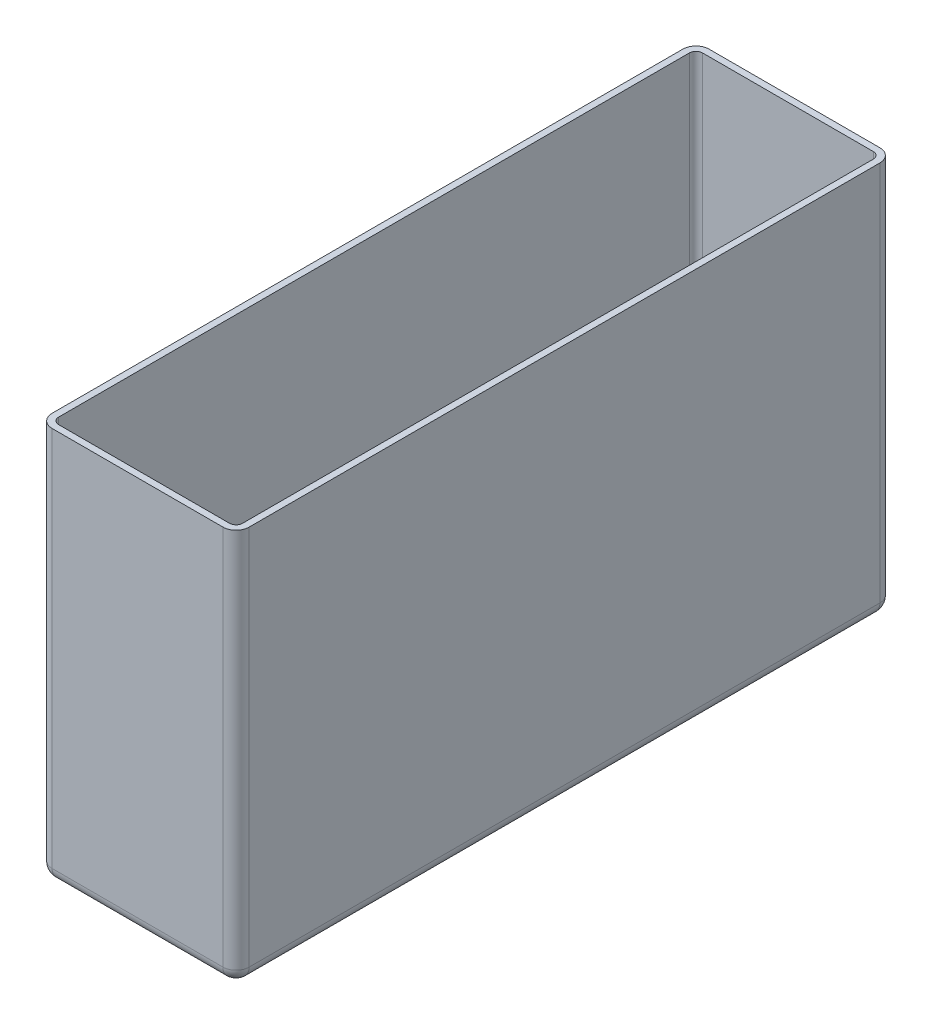
ISO-10303-21;
HEADER;
FILE_DESCRIPTION(('STEP AP214'),'2;1');
FILE_NAME('part.step','',(''),(''),'','','');
FILE_SCHEMA(('AUTOMOTIVE_DESIGN { 1 0 10303 214 1 1 1 1 }'));
ENDSEC;
DATA;
#1=APPLICATION_CONTEXT('core data for automotive mechanical design processes');
#2=APPLICATION_PROTOCOL_DEFINITION('international standard','automotive_design',2000,#1);
#3=PRODUCT_CONTEXT('',#1,'mechanical');
#4=PRODUCT('Part','Part','',(#3));
#5=PRODUCT_RELATED_PRODUCT_CATEGORY('part','',(#4));
#6=PRODUCT_DEFINITION_FORMATION('','',#4);
#7=PRODUCT_DEFINITION_CONTEXT('part definition',#1,'design');
#8=PRODUCT_DEFINITION('design','',#6,#7);
#9=PRODUCT_DEFINITION_SHAPE('','',#8);
#10=(LENGTH_UNIT() NAMED_UNIT(*) SI_UNIT(.MILLI.,.METRE.));
#11=(NAMED_UNIT(*) PLANE_ANGLE_UNIT() SI_UNIT($,.RADIAN.));
#12=(NAMED_UNIT(*) SI_UNIT($,.STERADIAN.) SOLID_ANGLE_UNIT());
#13=UNCERTAINTY_MEASURE_WITH_UNIT(LENGTH_MEASURE(1.E-05),#10,'distance_accuracy_value','');
#14=(GEOMETRIC_REPRESENTATION_CONTEXT(3) GLOBAL_UNCERTAINTY_ASSIGNED_CONTEXT((#13)) GLOBAL_UNIT_ASSIGNED_CONTEXT((#10,
#11,#12)) REPRESENTATION_CONTEXT('',''));
#15=CARTESIAN_POINT('',(0.,0.,0.));
#16=DIRECTION('',(0.,0.,1.));
#17=DIRECTION('',(1.,0.,0.));
#18=AXIS2_PLACEMENT_3D('',#15,#16,#17);
#19=CARTESIAN_POINT('',(-75.,300.,250.));
#20=DIRECTION('',(1.,0.,0.));
#21=DIRECTION('',(0.,0.,-1.));
#22=AXIS2_PLACEMENT_3D('',#19,#20,#21);
#23=PLANE('',#22);
#24=DIRECTION('',(0.,0.,1.));
#25=VECTOR('',#24,1.);
#26=CARTESIAN_POINT('',(-75.,300.,250.));
#27=LINE('',#26,#25);
#28=CARTESIAN_POINT('',(-75.,300.,-240.));
#29=VERTEX_POINT('',#28);
#30=CARTESIAN_POINT('',(-75.,300.,240.));
#31=VERTEX_POINT('',#30);
#32=EDGE_CURVE('E276',#29,#31,#27,.T.);
#33=ORIENTED_EDGE('',*,*,#32,.F.);
#34=DIRECTION('',(0.,-1.,0.));
#35=VECTOR('',#34,1.);
#36=CARTESIAN_POINT('',(-75.,300.,-240.));
#37=LINE('',#36,#35);
#38=CARTESIAN_POINT('',(-75.,10.,-240.));
#39=VERTEX_POINT('',#38);
#40=EDGE_CURVE('E56',#29,#39,#37,.T.);
#41=ORIENTED_EDGE('',*,*,#40,.T.);
#42=DIRECTION('',(0.,0.,1.));
#43=VECTOR('',#42,1.);
#44=CARTESIAN_POINT('',(-75.,10.,250.));
#45=LINE('',#44,#43);
#46=CARTESIAN_POINT('',(-75.,10.,240.));
#47=VERTEX_POINT('',#46);
#48=EDGE_CURVE('E318',#39,#47,#45,.T.);
#49=ORIENTED_EDGE('',*,*,#48,.T.);
#50=DIRECTION('',(0.,-1.,0.));
#51=VECTOR('',#50,1.);
#52=CARTESIAN_POINT('',(-75.,300.,240.));
#53=LINE('',#52,#51);
#54=EDGE_CURVE('E316',#47,#31,#53,.F.);
#55=ORIENTED_EDGE('',*,*,#54,.T.);
#56=EDGE_LOOP('',(#33,#41,#49,#55));
#57=FACE_BOUND('',#56,.T.);
#58=ADVANCED_FACE('F31',(#57),#23,.F.);
#59=CARTESIAN_POINT('',(75.,300.,250.));
#60=DIRECTION('',(0.,0.,-1.));
#61=DIRECTION('',(-1.,0.,0.));
#62=AXIS2_PLACEMENT_3D('',#59,#60,#61);
#63=PLANE('',#62);
#64=DIRECTION('',(1.,0.,0.));
#65=VECTOR('',#64,1.);
#66=CARTESIAN_POINT('',(75.,10.,250.));
#67=LINE('',#66,#65);
#68=CARTESIAN_POINT('',(-65.,10.,250.));
#69=VERTEX_POINT('',#68);
#70=CARTESIAN_POINT('',(65.,10.,250.));
#71=VERTEX_POINT('',#70);
#72=EDGE_CURVE('E290',#69,#71,#67,.T.);
#73=ORIENTED_EDGE('',*,*,#72,.T.);
#74=DIRECTION('',(0.,-1.,0.));
#75=VECTOR('',#74,1.);
#76=CARTESIAN_POINT('',(65.,300.,250.));
#77=LINE('',#76,#75);
#78=CARTESIAN_POINT('',(65.,300.,250.));
#79=VERTEX_POINT('',#78);
#80=EDGE_CURVE('E293',#71,#79,#77,.F.);
#81=ORIENTED_EDGE('',*,*,#80,.T.);
#82=DIRECTION('',(1.,0.,0.));
#83=VECTOR('',#82,1.);
#84=CARTESIAN_POINT('',(75.,300.,250.));
#85=LINE('',#84,#83);
#86=CARTESIAN_POINT('',(-65.,300.,250.));
#87=VERTEX_POINT('',#86);
#88=EDGE_CURVE('E279',#87,#79,#85,.T.);
#89=ORIENTED_EDGE('',*,*,#88,.F.);
#90=DIRECTION('',(0.,-1.,0.));
#91=VECTOR('',#90,1.);
#92=CARTESIAN_POINT('',(-65.,300.,250.));
#93=LINE('',#92,#91);
#94=EDGE_CURVE('E288',#87,#69,#93,.T.);
#95=ORIENTED_EDGE('',*,*,#94,.T.);
#96=EDGE_LOOP('',(#73,#81,#89,#95));
#97=FACE_BOUND('',#96,.T.);
#98=ADVANCED_FACE('F379',(#97),#63,.F.);
#99=CARTESIAN_POINT('',(75.,300.,250.));
#100=DIRECTION('',(-1.,0.,0.));
#101=DIRECTION('',(0.,0.,1.));
#102=AXIS2_PLACEMENT_3D('',#99,#100,#101);
#103=PLANE('',#102);
#104=DIRECTION('',(0.,0.,-1.));
#105=VECTOR('',#104,1.);
#106=CARTESIAN_POINT('',(75.,10.,250.));
#107=LINE('',#106,#105);
#108=CARTESIAN_POINT('',(75.,10.,240.));
#109=VERTEX_POINT('',#108);
#110=CARTESIAN_POINT('',(75.,10.,-240.));
#111=VERTEX_POINT('',#110);
#112=EDGE_CURVE('E306',#109,#111,#107,.T.);
#113=ORIENTED_EDGE('',*,*,#112,.T.);
#114=DIRECTION('',(0.,-1.,0.));
#115=VECTOR('',#114,1.);
#116=CARTESIAN_POINT('',(75.,300.,-240.));
#117=LINE('',#116,#115);
#118=CARTESIAN_POINT('',(75.,300.,-240.));
#119=VERTEX_POINT('',#118);
#120=EDGE_CURVE('E308',#111,#119,#117,.F.);
#121=ORIENTED_EDGE('',*,*,#120,.T.);
#122=DIRECTION('',(0.,0.,-1.));
#123=VECTOR('',#122,1.);
#124=CARTESIAN_POINT('',(75.,300.,250.));
#125=LINE('',#124,#123);
#126=CARTESIAN_POINT('',(75.,300.,240.));
#127=VERTEX_POINT('',#126);
#128=EDGE_CURVE('E282',#127,#119,#125,.T.);
#129=ORIENTED_EDGE('',*,*,#128,.F.);
#130=DIRECTION('',(0.,-1.,0.));
#131=VECTOR('',#130,1.);
#132=CARTESIAN_POINT('',(75.,300.,240.));
#133=LINE('',#132,#131);
#134=EDGE_CURVE('E304',#127,#109,#133,.T.);
#135=ORIENTED_EDGE('',*,*,#134,.T.);
#136=EDGE_LOOP('',(#113,#121,#129,#135));
#137=FACE_BOUND('',#136,.T.);
#138=ADVANCED_FACE('F389',(#137),#103,.F.);
#139=CARTESIAN_POINT('',(75.,300.,-250.));
#140=DIRECTION('',(0.,0.,1.));
#141=DIRECTION('',(1.,0.,0.));
#142=AXIS2_PLACEMENT_3D('',#139,#140,#141);
#143=PLANE('',#142);
#144=DIRECTION('',(-1.,0.,0.));
#145=VECTOR('',#144,1.);
#146=CARTESIAN_POINT('',(75.,10.,-250.));
#147=LINE('',#146,#145);
#148=CARTESIAN_POINT('',(65.,10.,-250.));
#149=VERTEX_POINT('',#148);
#150=CARTESIAN_POINT('',(-65.,10.,-250.));
#151=VERTEX_POINT('',#150);
#152=EDGE_CURVE('E312',#149,#151,#147,.T.);
#153=ORIENTED_EDGE('',*,*,#152,.T.);
#154=DIRECTION('',(0.,-1.,0.));
#155=VECTOR('',#154,1.);
#156=CARTESIAN_POINT('',(-65.,300.,-250.));
#157=LINE('',#156,#155);
#158=CARTESIAN_POINT('',(-65.,300.,-250.));
#159=VERTEX_POINT('',#158);
#160=EDGE_CURVE('E314',#151,#159,#157,.F.);
#161=ORIENTED_EDGE('',*,*,#160,.T.);
#162=DIRECTION('',(-1.,0.,0.));
#163=VECTOR('',#162,1.);
#164=CARTESIAN_POINT('',(75.,300.,-250.));
#165=LINE('',#164,#163);
#166=CARTESIAN_POINT('',(65.,300.,-250.));
#167=VERTEX_POINT('',#166);
#168=EDGE_CURVE('E285',#167,#159,#165,.T.);
#169=ORIENTED_EDGE('',*,*,#168,.F.);
#170=DIRECTION('',(0.,-1.,0.));
#171=VECTOR('',#170,1.);
#172=CARTESIAN_POINT('',(65.,300.,-250.));
#173=LINE('',#172,#171);
#174=EDGE_CURVE('E310',#167,#149,#173,.T.);
#175=ORIENTED_EDGE('',*,*,#174,.T.);
#176=EDGE_LOOP('',(#153,#161,#169,#175));
#177=FACE_BOUND('',#176,.T.);
#178=ADVANCED_FACE('F410',(#177),#143,.F.);
#179=CARTESIAN_POINT('',(-75.,300.,-250.));
#180=DIRECTION('',(0.,1.,0.));
#181=DIRECTION('',(0.,0.,1.));
#182=AXIS2_PLACEMENT_3D('',#179,#180,#181);
#183=PLANE('',#182);
#184=DIRECTION('',(-1.,0.,0.));
#185=VECTOR('',#184,1.);
#186=CARTESIAN_POINT('',(75.,300.,-245.));
#187=LINE('',#186,#185);
#188=CARTESIAN_POINT('',(65.,300.,-245.));
#189=VERTEX_POINT('',#188);
#190=CARTESIAN_POINT('',(-65.,300.,-245.));
#191=VERTEX_POINT('',#190);
#192=EDGE_CURVE('E249',#189,#191,#187,.T.);
#193=ORIENTED_EDGE('',*,*,#192,.F.);
#194=CARTESIAN_POINT('',(65.,300.,-240.));
#195=DIRECTION('',(0.,1.,0.));
#196=DIRECTION('',(0.,0.,1.));
#197=AXIS2_PLACEMENT_3D('',#194,#195,#196);
#198=CIRCLE('',#197,5.);
#199=CARTESIAN_POINT('',(70.,300.,-240.));
#200=VERTEX_POINT('',#199);
#201=EDGE_CURVE('E269',#200,#189,#198,.T.);
#202=ORIENTED_EDGE('',*,*,#201,.F.);
#203=DIRECTION('',(0.,0.,-1.));
#204=VECTOR('',#203,1.);
#205=CARTESIAN_POINT('',(70.,300.,250.));
#206=LINE('',#205,#204);
#207=CARTESIAN_POINT('',(70.,300.,240.));
#208=VERTEX_POINT('',#207);
#209=EDGE_CURVE('E48',#208,#200,#206,.T.);
#210=ORIENTED_EDGE('',*,*,#209,.F.);
#211=CARTESIAN_POINT('',(65.,300.,240.));
#212=DIRECTION('',(0.,1.,0.));
#213=DIRECTION('',(0.,0.,1.));
#214=AXIS2_PLACEMENT_3D('',#211,#212,#213);
#215=CIRCLE('',#214,5.);
#216=CARTESIAN_POINT('',(65.,300.,245.));
#217=VERTEX_POINT('',#216);
#218=EDGE_CURVE('E265',#217,#208,#215,.T.);
#219=ORIENTED_EDGE('',*,*,#218,.F.);
#220=DIRECTION('',(1.,0.,0.));
#221=VECTOR('',#220,1.);
#222=CARTESIAN_POINT('',(75.,300.,245.));
#223=LINE('',#222,#221);
#224=CARTESIAN_POINT('',(-65.,300.,245.));
#225=VERTEX_POINT('',#224);
#226=EDGE_CURVE('E263',#225,#217,#223,.T.);
#227=ORIENTED_EDGE('',*,*,#226,.F.);
#228=CARTESIAN_POINT('',(-65.,300.,240.));
#229=DIRECTION('',(0.,1.,0.));
#230=DIRECTION('',(0.,0.,1.));
#231=AXIS2_PLACEMENT_3D('',#228,#229,#230);
#232=CIRCLE('',#231,5.);
#233=CARTESIAN_POINT('',(-70.,300.,240.));
#234=VERTEX_POINT('',#233);
#235=EDGE_CURVE('E182',#234,#225,#232,.T.);
#236=ORIENTED_EDGE('',*,*,#235,.F.);
#237=DIRECTION('',(0.,0.,1.));
#238=VECTOR('',#237,1.);
#239=CARTESIAN_POINT('',(-70.,300.,250.));
#240=LINE('',#239,#238);
#241=CARTESIAN_POINT('',(-70.,300.,-240.));
#242=VERTEX_POINT('',#241);
#243=EDGE_CURVE('E239',#242,#234,#240,.T.);
#244=ORIENTED_EDGE('',*,*,#243,.F.);
#245=CARTESIAN_POINT('',(-65.,300.,-240.));
#246=DIRECTION('',(0.,1.,0.));
#247=DIRECTION('',(0.,0.,1.));
#248=AXIS2_PLACEMENT_3D('',#245,#246,#247);
#249=CIRCLE('',#248,5.);
#250=EDGE_CURVE('E177',#191,#242,#249,.T.);
#251=ORIENTED_EDGE('',*,*,#250,.F.);
#252=EDGE_LOOP('',(#193,#202,#210,#219,#227,#236,#244,#251));
#253=FACE_BOUND('',#252,.T.);
#254=ORIENTED_EDGE('',*,*,#168,.T.);
#255=CARTESIAN_POINT('',(-65.,300.,-240.));
#256=DIRECTION('',(0.,1.,0.));
#257=DIRECTION('',(0.,0.,1.));
#258=AXIS2_PLACEMENT_3D('',#255,#256,#257);
#259=CIRCLE('',#258,10.);
#260=EDGE_CURVE('E11',#159,#29,#259,.T.);
#261=ORIENTED_EDGE('',*,*,#260,.T.);
#262=ORIENTED_EDGE('',*,*,#32,.T.);
#263=CARTESIAN_POINT('',(-65.,300.,240.));
#264=DIRECTION('',(0.,1.,0.));
#265=DIRECTION('',(0.,0.,1.));
#266=AXIS2_PLACEMENT_3D('',#263,#264,#265);
#267=CIRCLE('',#266,10.);
#268=EDGE_CURVE('E321',#31,#87,#267,.T.);
#269=ORIENTED_EDGE('',*,*,#268,.T.);
#270=ORIENTED_EDGE('',*,*,#88,.T.);
#271=CARTESIAN_POINT('',(65.,300.,240.));
#272=DIRECTION('',(0.,1.,0.));
#273=DIRECTION('',(0.,0.,1.));
#274=AXIS2_PLACEMENT_3D('',#271,#272,#273);
#275=CIRCLE('',#274,10.);
#276=EDGE_CURVE('E323',#79,#127,#275,.T.);
#277=ORIENTED_EDGE('',*,*,#276,.T.);
#278=ORIENTED_EDGE('',*,*,#128,.T.);
#279=CARTESIAN_POINT('',(65.,300.,-240.));
#280=DIRECTION('',(0.,1.,0.));
#281=DIRECTION('',(0.,0.,1.));
#282=AXIS2_PLACEMENT_3D('',#279,#280,#281);
#283=CIRCLE('',#282,10.);
#284=EDGE_CURVE('E40',#119,#167,#283,.T.);
#285=ORIENTED_EDGE('',*,*,#284,.T.);
#286=EDGE_LOOP('',(#254,#261,#262,#269,#270,#277,#278,#285));
#287=FACE_BOUND('',#286,.T.);
#288=ADVANCED_FACE('F376',(#253,#287),#183,.T.);
#289=CARTESIAN_POINT('',(-75.,0.,-250.));
#290=DIRECTION('',(0.,1.,0.));
#291=DIRECTION('',(0.,0.,1.));
#292=AXIS2_PLACEMENT_3D('',#289,#290,#291);
#293=PLANE('',#292);
#294=DIRECTION('',(0.,0.,-1.));
#295=VECTOR('',#294,1.);
#296=CARTESIAN_POINT('',(65.,0.,-250.));
#297=LINE('',#296,#295);
#298=CARTESIAN_POINT('',(65.,0.,-240.));
#299=VERTEX_POINT('',#298);
#300=CARTESIAN_POINT('',(65.,0.,240.));
#301=VERTEX_POINT('',#300);
#302=EDGE_CURVE('E299',#299,#301,#297,.F.);
#303=ORIENTED_EDGE('',*,*,#302,.T.);
#304=DIRECTION('',(1.,0.,0.));
#305=VECTOR('',#304,1.);
#306=CARTESIAN_POINT('',(-75.,0.,240.));
#307=LINE('',#306,#305);
#308=CARTESIAN_POINT('',(-65.,0.,240.));
#309=VERTEX_POINT('',#308);
#310=EDGE_CURVE('E301',#301,#309,#307,.F.);
#311=ORIENTED_EDGE('',*,*,#310,.T.);
#312=DIRECTION('',(0.,0.,1.));
#313=VECTOR('',#312,1.);
#314=CARTESIAN_POINT('',(-65.,0.,-250.));
#315=LINE('',#314,#313);
#316=CARTESIAN_POINT('',(-65.,0.,-240.));
#317=VERTEX_POINT('',#316);
#318=EDGE_CURVE('E295',#309,#317,#315,.F.);
#319=ORIENTED_EDGE('',*,*,#318,.T.);
#320=DIRECTION('',(-1.,0.,0.));
#321=VECTOR('',#320,1.);
#322=CARTESIAN_POINT('',(-75.,0.,-240.));
#323=LINE('',#322,#321);
#324=EDGE_CURVE('E297',#317,#299,#323,.F.);
#325=ORIENTED_EDGE('',*,*,#324,.T.);
#326=EDGE_LOOP('',(#303,#311,#319,#325));
#327=FACE_BOUND('',#326,.T.);
#328=ADVANCED_FACE('F406',(#327),#293,.F.);
#329=CARTESIAN_POINT('',(-65.,300.,-240.));
#330=DIRECTION('',(0.,-1.,0.));
#331=DIRECTION('',(0.,0.,-1.));
#332=AXIS2_PLACEMENT_3D('',#329,#330,#331);
#333=CYLINDRICAL_SURFACE('',#332,10.);
#334=ORIENTED_EDGE('',*,*,#260,.F.);
#335=ORIENTED_EDGE('',*,*,#160,.F.);
#336=CARTESIAN_POINT('',(-65.,10.,-240.));
#337=DIRECTION('',(0.,-1.,0.));
#338=DIRECTION('',(0.,0.,-1.));
#339=AXIS2_PLACEMENT_3D('',#336,#337,#338);
#340=CIRCLE('',#339,10.);
#341=EDGE_CURVE('E352',#39,#151,#340,.T.);
#342=ORIENTED_EDGE('',*,*,#341,.F.);
#343=ORIENTED_EDGE('',*,*,#40,.F.);
#344=EDGE_LOOP('',(#334,#335,#342,#343));
#345=FACE_BOUND('',#344,.T.);
#346=ADVANCED_FACE('F33',(#345),#333,.T.);
#347=CARTESIAN_POINT('',(65.,300.,-240.));
#348=DIRECTION('',(0.,-1.,0.));
#349=DIRECTION('',(0.,0.,-1.));
#350=AXIS2_PLACEMENT_3D('',#347,#348,#349);
#351=CYLINDRICAL_SURFACE('',#350,10.);
#352=ORIENTED_EDGE('',*,*,#284,.F.);
#353=ORIENTED_EDGE('',*,*,#120,.F.);
#354=CARTESIAN_POINT('',(65.,10.,-240.));
#355=DIRECTION('',(0.,-1.,0.));
#356=DIRECTION('',(0.,0.,-1.));
#357=AXIS2_PLACEMENT_3D('',#354,#355,#356);
#358=CIRCLE('',#357,10.);
#359=EDGE_CURVE('E350',#149,#111,#358,.T.);
#360=ORIENTED_EDGE('',*,*,#359,.F.);
#361=ORIENTED_EDGE('',*,*,#174,.F.);
#362=EDGE_LOOP('',(#352,#353,#360,#361));
#363=FACE_BOUND('',#362,.T.);
#364=ADVANCED_FACE('F394',(#363),#351,.T.);
#365=CARTESIAN_POINT('',(75.,10.,-240.));
#366=DIRECTION('',(-1.,0.,0.));
#367=DIRECTION('',(0.,0.,1.));
#368=AXIS2_PLACEMENT_3D('',#365,#366,#367);
#369=CYLINDRICAL_SURFACE('',#368,10.);
#370=CARTESIAN_POINT('',(-65.,10.,-240.));
#371=DIRECTION('',(-1.,0.,0.));
#372=DIRECTION('',(0.,0.,1.));
#373=AXIS2_PLACEMENT_3D('',#370,#371,#372);
#374=CIRCLE('',#373,10.);
#375=EDGE_CURVE('E35',#151,#317,#374,.T.);
#376=ORIENTED_EDGE('',*,*,#375,.F.);
#377=ORIENTED_EDGE('',*,*,#152,.F.);
#378=CARTESIAN_POINT('',(65.,10.,-240.));
#379=DIRECTION('',(1.,0.,0.));
#380=DIRECTION('',(0.,0.,-1.));
#381=AXIS2_PLACEMENT_3D('',#378,#379,#380);
#382=CIRCLE('',#381,10.);
#383=EDGE_CURVE('E347',#299,#149,#382,.T.);
#384=ORIENTED_EDGE('',*,*,#383,.F.);
#385=ORIENTED_EDGE('',*,*,#324,.F.);
#386=EDGE_LOOP('',(#376,#377,#384,#385));
#387=FACE_BOUND('',#386,.T.);
#388=ADVANCED_FACE('F407',(#387),#369,.T.);
#389=CARTESIAN_POINT('',(-65.,10.,-240.));
#390=DIRECTION('',(0.,0.,1.));
#391=DIRECTION('',(1.,0.,0.));
#392=AXIS2_PLACEMENT_3D('',#389,#390,#391);
#393=SPHERICAL_SURFACE('',#392,10.);
#394=ORIENTED_EDGE('',*,*,#341,.T.);
#395=ORIENTED_EDGE('',*,*,#375,.T.);
#396=CARTESIAN_POINT('',(-65.,10.,-240.));
#397=DIRECTION('',(0.,0.,-1.));
#398=DIRECTION('',(-1.,0.,0.));
#399=AXIS2_PLACEMENT_3D('',#396,#397,#398);
#400=CIRCLE('',#399,10.);
#401=EDGE_CURVE('E344',#39,#317,#400,.F.);
#402=ORIENTED_EDGE('',*,*,#401,.F.);
#403=EDGE_LOOP('',(#394,#395,#402));
#404=FACE_BOUND('',#403,.T.);
#405=ADVANCED_FACE('F358',(#404),#393,.T.);
#406=CARTESIAN_POINT('',(65.,10.,-240.));
#407=DIRECTION('',(0.,0.,1.));
#408=DIRECTION('',(1.,0.,0.));
#409=AXIS2_PLACEMENT_3D('',#406,#407,#408);
#410=SPHERICAL_SURFACE('',#409,10.);
#411=ORIENTED_EDGE('',*,*,#383,.T.);
#412=ORIENTED_EDGE('',*,*,#359,.T.);
#413=CARTESIAN_POINT('',(65.,10.,-240.));
#414=DIRECTION('',(0.,0.,-1.));
#415=DIRECTION('',(-1.,0.,0.));
#416=AXIS2_PLACEMENT_3D('',#413,#414,#415);
#417=CIRCLE('',#416,10.);
#418=EDGE_CURVE('E341',#299,#111,#417,.F.);
#419=ORIENTED_EDGE('',*,*,#418,.F.);
#420=EDGE_LOOP('',(#411,#412,#419));
#421=FACE_BOUND('',#420,.T.);
#422=ADVANCED_FACE('F398',(#421),#410,.T.);
#423=CARTESIAN_POINT('',(-65.,10.,250.));
#424=DIRECTION('',(0.,0.,1.));
#425=DIRECTION('',(1.,0.,0.));
#426=AXIS2_PLACEMENT_3D('',#423,#424,#425);
#427=CYLINDRICAL_SURFACE('',#426,10.);
#428=ORIENTED_EDGE('',*,*,#401,.T.);
#429=ORIENTED_EDGE('',*,*,#318,.F.);
#430=CARTESIAN_POINT('',(-65.,10.,240.));
#431=DIRECTION('',(0.,0.,1.));
#432=DIRECTION('',(1.,0.,0.));
#433=AXIS2_PLACEMENT_3D('',#430,#431,#432);
#434=CIRCLE('',#433,10.);
#435=EDGE_CURVE('E338',#47,#309,#434,.T.);
#436=ORIENTED_EDGE('',*,*,#435,.F.);
#437=ORIENTED_EDGE('',*,*,#48,.F.);
#438=EDGE_LOOP('',(#428,#429,#436,#437));
#439=FACE_BOUND('',#438,.T.);
#440=ADVANCED_FACE('F365',(#439),#427,.T.);
#441=CARTESIAN_POINT('',(-65.,300.,240.));
#442=DIRECTION('',(0.,-1.,0.));
#443=DIRECTION('',(0.,0.,-1.));
#444=AXIS2_PLACEMENT_3D('',#441,#442,#443);
#445=CYLINDRICAL_SURFACE('',#444,10.);
#446=ORIENTED_EDGE('',*,*,#268,.F.);
#447=ORIENTED_EDGE('',*,*,#54,.F.);
#448=CARTESIAN_POINT('',(-65.,10.,240.));
#449=DIRECTION('',(0.,-1.,0.));
#450=DIRECTION('',(0.,0.,-1.));
#451=AXIS2_PLACEMENT_3D('',#448,#449,#450);
#452=CIRCLE('',#451,10.);
#453=EDGE_CURVE('E335',#69,#47,#452,.T.);
#454=ORIENTED_EDGE('',*,*,#453,.F.);
#455=ORIENTED_EDGE('',*,*,#94,.F.);
#456=EDGE_LOOP('',(#446,#447,#454,#455));
#457=FACE_BOUND('',#456,.T.);
#458=ADVANCED_FACE('F371',(#457),#445,.T.);
#459=CARTESIAN_POINT('',(65.,300.,240.));
#460=DIRECTION('',(0.,-1.,0.));
#461=DIRECTION('',(0.,0.,-1.));
#462=AXIS2_PLACEMENT_3D('',#459,#460,#461);
#463=CYLINDRICAL_SURFACE('',#462,10.);
#464=ORIENTED_EDGE('',*,*,#276,.F.);
#465=ORIENTED_EDGE('',*,*,#80,.F.);
#466=CARTESIAN_POINT('',(65.,10.,240.));
#467=DIRECTION('',(0.,-1.,0.));
#468=DIRECTION('',(0.,0.,-1.));
#469=AXIS2_PLACEMENT_3D('',#466,#467,#468);
#470=CIRCLE('',#469,10.);
#471=EDGE_CURVE('E332',#109,#71,#470,.T.);
#472=ORIENTED_EDGE('',*,*,#471,.F.);
#473=ORIENTED_EDGE('',*,*,#134,.F.);
#474=EDGE_LOOP('',(#464,#465,#472,#473));
#475=FACE_BOUND('',#474,.T.);
#476=ADVANCED_FACE('F384',(#475),#463,.T.);
#477=CARTESIAN_POINT('',(65.,10.,250.));
#478=DIRECTION('',(0.,0.,-1.));
#479=DIRECTION('',(-1.,0.,0.));
#480=AXIS2_PLACEMENT_3D('',#477,#478,#479);
#481=CYLINDRICAL_SURFACE('',#480,10.);
#482=ORIENTED_EDGE('',*,*,#418,.T.);
#483=ORIENTED_EDGE('',*,*,#112,.F.);
#484=CARTESIAN_POINT('',(65.,10.,240.));
#485=DIRECTION('',(0.,0.,1.));
#486=DIRECTION('',(1.,0.,0.));
#487=AXIS2_PLACEMENT_3D('',#484,#485,#486);
#488=CIRCLE('',#487,10.);
#489=EDGE_CURVE('E329',#301,#109,#488,.T.);
#490=ORIENTED_EDGE('',*,*,#489,.F.);
#491=ORIENTED_EDGE('',*,*,#302,.F.);
#492=EDGE_LOOP('',(#482,#483,#490,#491));
#493=FACE_BOUND('',#492,.T.);
#494=ADVANCED_FACE('F402',(#493),#481,.T.);
#495=CARTESIAN_POINT('',(-65.,10.,240.));
#496=DIRECTION('',(0.,0.,1.));
#497=DIRECTION('',(1.,0.,0.));
#498=AXIS2_PLACEMENT_3D('',#495,#496,#497);
#499=SPHERICAL_SURFACE('',#498,10.);
#500=ORIENTED_EDGE('',*,*,#453,.T.);
#501=ORIENTED_EDGE('',*,*,#435,.T.);
#502=CARTESIAN_POINT('',(-65.,10.,240.));
#503=DIRECTION('',(-1.,0.,0.));
#504=DIRECTION('',(0.,0.,1.));
#505=AXIS2_PLACEMENT_3D('',#502,#503,#504);
#506=CIRCLE('',#505,10.);
#507=EDGE_CURVE('E327',#69,#309,#506,.F.);
#508=ORIENTED_EDGE('',*,*,#507,.F.);
#509=EDGE_LOOP('',(#500,#501,#508));
#510=FACE_BOUND('',#509,.T.);
#511=ADVANCED_FACE('F435',(#510),#499,.T.);
#512=CARTESIAN_POINT('',(65.,10.,240.));
#513=DIRECTION('',(0.,0.,1.));
#514=DIRECTION('',(1.,0.,0.));
#515=AXIS2_PLACEMENT_3D('',#512,#513,#514);
#516=SPHERICAL_SURFACE('',#515,10.);
#517=ORIENTED_EDGE('',*,*,#489,.T.);
#518=ORIENTED_EDGE('',*,*,#471,.T.);
#519=CARTESIAN_POINT('',(65.,10.,240.));
#520=DIRECTION('',(1.,0.,0.));
#521=DIRECTION('',(0.,0.,-1.));
#522=AXIS2_PLACEMENT_3D('',#519,#520,#521);
#523=CIRCLE('',#522,10.);
#524=EDGE_CURVE('E275',#301,#71,#523,.F.);
#525=ORIENTED_EDGE('',*,*,#524,.F.);
#526=EDGE_LOOP('',(#517,#518,#525));
#527=FACE_BOUND('',#526,.T.);
#528=ADVANCED_FACE('F431',(#527),#516,.T.);
#529=CARTESIAN_POINT('',(75.,10.,240.));
#530=DIRECTION('',(1.,0.,0.));
#531=DIRECTION('',(0.,0.,-1.));
#532=AXIS2_PLACEMENT_3D('',#529,#530,#531);
#533=CYLINDRICAL_SURFACE('',#532,10.);
#534=ORIENTED_EDGE('',*,*,#507,.T.);
#535=ORIENTED_EDGE('',*,*,#310,.F.);
#536=ORIENTED_EDGE('',*,*,#524,.T.);
#537=ORIENTED_EDGE('',*,*,#72,.F.);
#538=EDGE_LOOP('',(#534,#535,#536,#537));
#539=FACE_BOUND('',#538,.T.);
#540=ADVANCED_FACE('F428',(#539),#533,.T.);
#541=CARTESIAN_POINT('',(-70.,300.,250.));
#542=DIRECTION('',(1.,0.,0.));
#543=DIRECTION('',(0.,0.,-1.));
#544=AXIS2_PLACEMENT_3D('',#541,#542,#543);
#545=PLANE('',#544);
#546=ORIENTED_EDGE('',*,*,#243,.T.);
#547=DIRECTION('',(0.,1.,0.));
#548=VECTOR('',#547,1.);
#549=CARTESIAN_POINT('',(-70.,300.,240.));
#550=LINE('',#549,#548);
#551=CARTESIAN_POINT('',(-70.,10.,240.));
#552=VERTEX_POINT('',#551);
#553=EDGE_CURVE('E206',#552,#234,#550,.T.);
#554=ORIENTED_EDGE('',*,*,#553,.F.);
#555=DIRECTION('',(0.,0.,-1.));
#556=VECTOR('',#555,1.);
#557=CARTESIAN_POINT('',(-70.,10.,250.));
#558=LINE('',#557,#556);
#559=CARTESIAN_POINT('',(-70.,10.,-240.));
#560=VERTEX_POINT('',#559);
#561=EDGE_CURVE('E183',#560,#552,#558,.F.);
#562=ORIENTED_EDGE('',*,*,#561,.F.);
#563=DIRECTION('',(0.,1.,0.));
#564=VECTOR('',#563,1.);
#565=CARTESIAN_POINT('',(-70.,300.,-240.));
#566=LINE('',#565,#564);
#567=EDGE_CURVE('E172',#242,#560,#566,.F.);
#568=ORIENTED_EDGE('',*,*,#567,.F.);
#569=EDGE_LOOP('',(#546,#554,#562,#568));
#570=FACE_BOUND('',#569,.T.);
#571=ADVANCED_FACE('F205',(#570),#545,.T.);
#572=CARTESIAN_POINT('',(75.,300.,245.));
#573=DIRECTION('',(0.,0.,-1.));
#574=DIRECTION('',(-1.,0.,0.));
#575=AXIS2_PLACEMENT_3D('',#572,#573,#574);
#576=PLANE('',#575);
#577=DIRECTION('',(-1.,0.,0.));
#578=VECTOR('',#577,1.);
#579=CARTESIAN_POINT('',(75.,10.,245.));
#580=LINE('',#579,#578);
#581=CARTESIAN_POINT('',(-65.,10.,245.));
#582=VERTEX_POINT('',#581);
#583=CARTESIAN_POINT('',(65.,10.,245.));
#584=VERTEX_POINT('',#583);
#585=EDGE_CURVE('E248',#582,#584,#580,.F.);
#586=ORIENTED_EDGE('',*,*,#585,.F.);
#587=DIRECTION('',(0.,1.,0.));
#588=VECTOR('',#587,1.);
#589=CARTESIAN_POINT('',(-65.,300.,245.));
#590=LINE('',#589,#588);
#591=EDGE_CURVE('E246',#225,#582,#590,.F.);
#592=ORIENTED_EDGE('',*,*,#591,.F.);
#593=ORIENTED_EDGE('',*,*,#226,.T.);
#594=DIRECTION('',(0.,1.,0.));
#595=VECTOR('',#594,1.);
#596=CARTESIAN_POINT('',(65.,300.,245.));
#597=LINE('',#596,#595);
#598=EDGE_CURVE('E237',#584,#217,#597,.T.);
#599=ORIENTED_EDGE('',*,*,#598,.F.);
#600=EDGE_LOOP('',(#586,#592,#593,#599));
#601=FACE_BOUND('',#600,.T.);
#602=ADVANCED_FACE('F500',(#601),#576,.T.);
#603=CARTESIAN_POINT('',(70.,300.,250.));
#604=DIRECTION('',(-1.,0.,0.));
#605=DIRECTION('',(0.,0.,1.));
#606=AXIS2_PLACEMENT_3D('',#603,#604,#605);
#607=PLANE('',#606);
#608=DIRECTION('',(0.,0.,1.));
#609=VECTOR('',#608,1.);
#610=CARTESIAN_POINT('',(70.,10.,250.));
#611=LINE('',#610,#609);
#612=CARTESIAN_POINT('',(70.,10.,240.));
#613=VERTEX_POINT('',#612);
#614=CARTESIAN_POINT('',(70.,10.,-240.));
#615=VERTEX_POINT('',#614);
#616=EDGE_CURVE('E219',#613,#615,#611,.F.);
#617=ORIENTED_EDGE('',*,*,#616,.F.);
#618=DIRECTION('',(0.,1.,0.));
#619=VECTOR('',#618,1.);
#620=CARTESIAN_POINT('',(70.,300.,240.));
#621=LINE('',#620,#619);
#622=EDGE_CURVE('E223',#208,#613,#621,.F.);
#623=ORIENTED_EDGE('',*,*,#622,.F.);
#624=ORIENTED_EDGE('',*,*,#209,.T.);
#625=DIRECTION('',(0.,1.,0.));
#626=VECTOR('',#625,1.);
#627=CARTESIAN_POINT('',(70.,300.,-240.));
#628=LINE('',#627,#626);
#629=EDGE_CURVE('E217',#615,#200,#628,.T.);
#630=ORIENTED_EDGE('',*,*,#629,.F.);
#631=EDGE_LOOP('',(#617,#623,#624,#630));
#632=FACE_BOUND('',#631,.T.);
#633=ADVANCED_FACE('F507',(#632),#607,.T.);
#634=CARTESIAN_POINT('',(75.,300.,-245.));
#635=DIRECTION('',(0.,0.,1.));
#636=DIRECTION('',(1.,0.,0.));
#637=AXIS2_PLACEMENT_3D('',#634,#635,#636);
#638=PLANE('',#637);
#639=DIRECTION('',(1.,0.,0.));
#640=VECTOR('',#639,1.);
#641=CARTESIAN_POINT('',(75.,10.,-245.));
#642=LINE('',#641,#640);
#643=CARTESIAN_POINT('',(65.,10.,-245.));
#644=VERTEX_POINT('',#643);
#645=CARTESIAN_POINT('',(-65.,10.,-245.));
#646=VERTEX_POINT('',#645);
#647=EDGE_CURVE('E212',#644,#646,#642,.F.);
#648=ORIENTED_EDGE('',*,*,#647,.F.);
#649=DIRECTION('',(0.,1.,0.));
#650=VECTOR('',#649,1.);
#651=CARTESIAN_POINT('',(65.,300.,-245.));
#652=LINE('',#651,#650);
#653=EDGE_CURVE('E215',#189,#644,#652,.F.);
#654=ORIENTED_EDGE('',*,*,#653,.F.);
#655=ORIENTED_EDGE('',*,*,#192,.T.);
#656=DIRECTION('',(0.,1.,0.));
#657=VECTOR('',#656,1.);
#658=CARTESIAN_POINT('',(-65.,300.,-245.));
#659=LINE('',#658,#657);
#660=EDGE_CURVE('E209',#646,#191,#659,.T.);
#661=ORIENTED_EDGE('',*,*,#660,.F.);
#662=EDGE_LOOP('',(#648,#654,#655,#661));
#663=FACE_BOUND('',#662,.T.);
#664=ADVANCED_FACE('F515',(#663),#638,.T.);
#665=CARTESIAN_POINT('',(-75.,5.,-250.));
#666=DIRECTION('',(0.,1.,0.));
#667=DIRECTION('',(0.,0.,1.));
#668=AXIS2_PLACEMENT_3D('',#665,#666,#667);
#669=PLANE('',#668);
#670=DIRECTION('',(0.,0.,1.));
#671=VECTOR('',#670,1.);
#672=CARTESIAN_POINT('',(65.,5.,-250.));
#673=LINE('',#672,#671);
#674=CARTESIAN_POINT('',(65.,5.,-240.));
#675=VERTEX_POINT('',#674);
#676=CARTESIAN_POINT('',(65.,5.,240.));
#677=VERTEX_POINT('',#676);
#678=EDGE_CURVE('E231',#675,#677,#673,.T.);
#679=ORIENTED_EDGE('',*,*,#678,.F.);
#680=DIRECTION('',(1.,0.,0.));
#681=VECTOR('',#680,1.);
#682=CARTESIAN_POINT('',(-75.,5.,-240.));
#683=LINE('',#682,#681);
#684=CARTESIAN_POINT('',(-65.,5.,-240.));
#685=VERTEX_POINT('',#684);
#686=EDGE_CURVE('E233',#685,#675,#683,.T.);
#687=ORIENTED_EDGE('',*,*,#686,.F.);
#688=DIRECTION('',(0.,0.,1.));
#689=VECTOR('',#688,1.);
#690=CARTESIAN_POINT('',(-65.,5.,-250.));
#691=LINE('',#690,#689);
#692=CARTESIAN_POINT('',(-65.,5.00000000000001,240.));
#693=VERTEX_POINT('',#692);
#694=EDGE_CURVE('E200',#693,#685,#691,.F.);
#695=ORIENTED_EDGE('',*,*,#694,.F.);
#696=DIRECTION('',(1.,0.,0.));
#697=VECTOR('',#696,1.);
#698=CARTESIAN_POINT('',(-75.,5.,240.));
#699=LINE('',#698,#697);
#700=EDGE_CURVE('E225',#677,#693,#699,.F.);
#701=ORIENTED_EDGE('',*,*,#700,.F.);
#702=EDGE_LOOP('',(#679,#687,#695,#701));
#703=FACE_BOUND('',#702,.T.);
#704=ADVANCED_FACE('F522',(#703),#669,.T.);
#705=CARTESIAN_POINT('',(-65.,300.,-240.));
#706=DIRECTION('',(0.,-1.,0.));
#707=DIRECTION('',(0.,0.,-1.));
#708=AXIS2_PLACEMENT_3D('',#705,#706,#707);
#709=CYLINDRICAL_SURFACE('',#708,5.);
#710=ORIENTED_EDGE('',*,*,#250,.T.);
#711=ORIENTED_EDGE('',*,*,#567,.T.);
#712=CARTESIAN_POINT('',(-65.,10.,-240.));
#713=DIRECTION('',(0.,1.,0.));
#714=DIRECTION('',(-1.,0.,0.));
#715=AXIS2_PLACEMENT_3D('',#712,#713,#714);
#716=CIRCLE('',#715,5.);
#717=EDGE_CURVE('E175',#560,#646,#716,.F.);
#718=ORIENTED_EDGE('',*,*,#717,.T.);
#719=ORIENTED_EDGE('',*,*,#660,.T.);
#720=EDGE_LOOP('',(#710,#711,#718,#719));
#721=FACE_BOUND('',#720,.T.);
#722=ADVANCED_FACE('F174',(#721),#709,.F.);
#723=CARTESIAN_POINT('',(65.,300.,-240.));
#724=DIRECTION('',(0.,-1.,0.));
#725=DIRECTION('',(0.,0.,-1.));
#726=AXIS2_PLACEMENT_3D('',#723,#724,#725);
#727=CYLINDRICAL_SURFACE('',#726,5.);
#728=ORIENTED_EDGE('',*,*,#201,.T.);
#729=ORIENTED_EDGE('',*,*,#653,.T.);
#730=CARTESIAN_POINT('',(65.,10.,-240.));
#731=DIRECTION('',(0.,-1.,0.));
#732=DIRECTION('',(1.,0.,0.));
#733=AXIS2_PLACEMENT_3D('',#730,#731,#732);
#734=CIRCLE('',#733,5.);
#735=EDGE_CURVE('E193',#644,#615,#734,.T.);
#736=ORIENTED_EDGE('',*,*,#735,.T.);
#737=ORIENTED_EDGE('',*,*,#629,.T.);
#738=EDGE_LOOP('',(#728,#729,#736,#737));
#739=FACE_BOUND('',#738,.T.);
#740=ADVANCED_FACE('F537',(#739),#727,.F.);
#741=CARTESIAN_POINT('',(75.,10.,-240.));
#742=DIRECTION('',(-1.,0.,0.));
#743=DIRECTION('',(0.,0.,1.));
#744=AXIS2_PLACEMENT_3D('',#741,#742,#743);
#745=CYLINDRICAL_SURFACE('',#744,5.);
#746=CARTESIAN_POINT('',(-65.,10.,-240.));
#747=DIRECTION('',(-1.,0.,0.));
#748=DIRECTION('',(0.,-1.,0.));
#749=AXIS2_PLACEMENT_3D('',#746,#747,#748);
#750=CIRCLE('',#749,5.);
#751=EDGE_CURVE('E192',#646,#685,#750,.T.);
#752=ORIENTED_EDGE('',*,*,#751,.T.);
#753=ORIENTED_EDGE('',*,*,#686,.T.);
#754=CARTESIAN_POINT('',(65.,10.,-240.));
#755=DIRECTION('',(-1.,0.,0.));
#756=DIRECTION('',(0.,-1.,0.));
#757=AXIS2_PLACEMENT_3D('',#754,#755,#756);
#758=CIRCLE('',#757,5.);
#759=EDGE_CURVE('E202',#675,#644,#758,.F.);
#760=ORIENTED_EDGE('',*,*,#759,.T.);
#761=ORIENTED_EDGE('',*,*,#647,.T.);
#762=EDGE_LOOP('',(#752,#753,#760,#761));
#763=FACE_BOUND('',#762,.T.);
#764=ADVANCED_FACE('F544',(#763),#745,.F.);
#765=CARTESIAN_POINT('',(-65.,10.,-240.));
#766=DIRECTION('',(0.,0.,1.));
#767=DIRECTION('',(1.,0.,0.));
#768=AXIS2_PLACEMENT_3D('',#765,#766,#767);
#769=SPHERICAL_SURFACE('',#768,5.);
#770=ORIENTED_EDGE('',*,*,#717,.F.);
#771=CARTESIAN_POINT('',(-65.,10.,-240.));
#772=DIRECTION('',(0.,0.,1.));
#773=DIRECTION('',(1.,0.,0.));
#774=AXIS2_PLACEMENT_3D('',#771,#772,#773);
#775=CIRCLE('',#774,5.);
#776=EDGE_CURVE('E190',#560,#685,#775,.T.);
#777=ORIENTED_EDGE('',*,*,#776,.T.);
#778=ORIENTED_EDGE('',*,*,#751,.F.);
#779=EDGE_LOOP('',(#770,#777,#778));
#780=FACE_BOUND('',#779,.T.);
#781=ADVANCED_FACE('F189',(#780),#769,.F.);
#782=CARTESIAN_POINT('',(65.,10.,-240.));
#783=DIRECTION('',(0.,0.,1.));
#784=DIRECTION('',(1.,0.,0.));
#785=AXIS2_PLACEMENT_3D('',#782,#783,#784);
#786=SPHERICAL_SURFACE('',#785,5.);
#787=ORIENTED_EDGE('',*,*,#759,.F.);
#788=CARTESIAN_POINT('',(65.,10.,-240.));
#789=DIRECTION('',(0.,0.,-1.));
#790=DIRECTION('',(-1.,0.,0.));
#791=AXIS2_PLACEMENT_3D('',#788,#789,#790);
#792=CIRCLE('',#791,5.);
#793=EDGE_CURVE('E203',#675,#615,#792,.F.);
#794=ORIENTED_EDGE('',*,*,#793,.T.);
#795=ORIENTED_EDGE('',*,*,#735,.F.);
#796=EDGE_LOOP('',(#787,#794,#795));
#797=FACE_BOUND('',#796,.T.);
#798=ADVANCED_FACE('F559',(#797),#786,.F.);
#799=CARTESIAN_POINT('',(-65.,10.,250.));
#800=DIRECTION('',(0.,0.,1.));
#801=DIRECTION('',(1.,0.,0.));
#802=AXIS2_PLACEMENT_3D('',#799,#800,#801);
#803=CYLINDRICAL_SURFACE('',#802,5.);
#804=ORIENTED_EDGE('',*,*,#776,.F.);
#805=ORIENTED_EDGE('',*,*,#561,.T.);
#806=CARTESIAN_POINT('',(-65.,10.,240.));
#807=DIRECTION('',(0.,0.,1.));
#808=DIRECTION('',(1.,0.,0.));
#809=AXIS2_PLACEMENT_3D('',#806,#807,#808);
#810=CIRCLE('',#809,5.);
#811=EDGE_CURVE('E230',#552,#693,#810,.T.);
#812=ORIENTED_EDGE('',*,*,#811,.T.);
#813=ORIENTED_EDGE('',*,*,#694,.T.);
#814=EDGE_LOOP('',(#804,#805,#812,#813));
#815=FACE_BOUND('',#814,.T.);
#816=ADVANCED_FACE('F196',(#815),#803,.F.);
#817=CARTESIAN_POINT('',(-65.,300.,240.));
#818=DIRECTION('',(0.,-1.,0.));
#819=DIRECTION('',(0.,0.,-1.));
#820=AXIS2_PLACEMENT_3D('',#817,#818,#819);
#821=CYLINDRICAL_SURFACE('',#820,5.);
#822=ORIENTED_EDGE('',*,*,#235,.T.);
#823=ORIENTED_EDGE('',*,*,#591,.T.);
#824=CARTESIAN_POINT('',(-65.,10.,240.));
#825=DIRECTION('',(0.,1.,0.));
#826=DIRECTION('',(-1.,0.,0.));
#827=AXIS2_PLACEMENT_3D('',#824,#825,#826);
#828=CIRCLE('',#827,5.);
#829=EDGE_CURVE('E242',#582,#552,#828,.F.);
#830=ORIENTED_EDGE('',*,*,#829,.T.);
#831=ORIENTED_EDGE('',*,*,#553,.T.);
#832=EDGE_LOOP('',(#822,#823,#830,#831));
#833=FACE_BOUND('',#832,.T.);
#834=ADVANCED_FACE('F573',(#833),#821,.F.);
#835=CARTESIAN_POINT('',(65.,300.,240.));
#836=DIRECTION('',(0.,-1.,0.));
#837=DIRECTION('',(0.,0.,-1.));
#838=AXIS2_PLACEMENT_3D('',#835,#836,#837);
#839=CYLINDRICAL_SURFACE('',#838,5.);
#840=ORIENTED_EDGE('',*,*,#218,.T.);
#841=ORIENTED_EDGE('',*,*,#622,.T.);
#842=CARTESIAN_POINT('',(65.,10.,240.));
#843=DIRECTION('',(0.,-1.,0.));
#844=DIRECTION('',(1.,0.,0.));
#845=AXIS2_PLACEMENT_3D('',#842,#843,#844);
#846=CIRCLE('',#845,5.);
#847=EDGE_CURVE('E245',#613,#584,#846,.T.);
#848=ORIENTED_EDGE('',*,*,#847,.T.);
#849=ORIENTED_EDGE('',*,*,#598,.T.);
#850=EDGE_LOOP('',(#840,#841,#848,#849));
#851=FACE_BOUND('',#850,.T.);
#852=ADVANCED_FACE('F580',(#851),#839,.F.);
#853=CARTESIAN_POINT('',(65.,10.,250.));
#854=DIRECTION('',(0.,0.,-1.));
#855=DIRECTION('',(-1.,0.,0.));
#856=AXIS2_PLACEMENT_3D('',#853,#854,#855);
#857=CYLINDRICAL_SURFACE('',#856,5.);
#858=ORIENTED_EDGE('',*,*,#793,.F.);
#859=ORIENTED_EDGE('',*,*,#678,.T.);
#860=CARTESIAN_POINT('',(65.,10.,240.));
#861=DIRECTION('',(0.,0.,1.));
#862=DIRECTION('',(1.,0.,0.));
#863=AXIS2_PLACEMENT_3D('',#860,#861,#862);
#864=CIRCLE('',#863,5.);
#865=EDGE_CURVE('E255',#677,#613,#864,.T.);
#866=ORIENTED_EDGE('',*,*,#865,.T.);
#867=ORIENTED_EDGE('',*,*,#616,.T.);
#868=EDGE_LOOP('',(#858,#859,#866,#867));
#869=FACE_BOUND('',#868,.T.);
#870=ADVANCED_FACE('F588',(#869),#857,.F.);
#871=CARTESIAN_POINT('',(-65.,10.,240.));
#872=DIRECTION('',(0.,0.,1.));
#873=DIRECTION('',(1.,0.,0.));
#874=AXIS2_PLACEMENT_3D('',#871,#872,#873);
#875=SPHERICAL_SURFACE('',#874,5.);
#876=ORIENTED_EDGE('',*,*,#829,.F.);
#877=CARTESIAN_POINT('',(-65.,10.,240.));
#878=DIRECTION('',(1.,0.,0.));
#879=DIRECTION('',(0.,0.,-1.));
#880=AXIS2_PLACEMENT_3D('',#877,#878,#879);
#881=CIRCLE('',#880,5.);
#882=EDGE_CURVE('E258',#582,#693,#881,.T.);
#883=ORIENTED_EDGE('',*,*,#882,.T.);
#884=ORIENTED_EDGE('',*,*,#811,.F.);
#885=EDGE_LOOP('',(#876,#883,#884));
#886=FACE_BOUND('',#885,.T.);
#887=ADVANCED_FACE('F596',(#886),#875,.F.);
#888=CARTESIAN_POINT('',(65.,10.,240.));
#889=DIRECTION('',(0.,0.,1.));
#890=DIRECTION('',(1.,0.,0.));
#891=AXIS2_PLACEMENT_3D('',#888,#889,#890);
#892=SPHERICAL_SURFACE('',#891,5.);
#893=ORIENTED_EDGE('',*,*,#865,.F.);
#894=CARTESIAN_POINT('',(65.,10.,240.));
#895=DIRECTION('',(1.,0.,0.));
#896=DIRECTION('',(0.,0.,-1.));
#897=AXIS2_PLACEMENT_3D('',#894,#895,#896);
#898=CIRCLE('',#897,5.);
#899=EDGE_CURVE('E259',#677,#584,#898,.F.);
#900=ORIENTED_EDGE('',*,*,#899,.T.);
#901=ORIENTED_EDGE('',*,*,#847,.F.);
#902=EDGE_LOOP('',(#893,#900,#901));
#903=FACE_BOUND('',#902,.T.);
#904=ADVANCED_FACE('F604',(#903),#892,.F.);
#905=CARTESIAN_POINT('',(75.,10.,240.));
#906=DIRECTION('',(1.,0.,0.));
#907=DIRECTION('',(0.,0.,-1.));
#908=AXIS2_PLACEMENT_3D('',#905,#906,#907);
#909=CYLINDRICAL_SURFACE('',#908,5.);
#910=ORIENTED_EDGE('',*,*,#882,.F.);
#911=ORIENTED_EDGE('',*,*,#585,.T.);
#912=ORIENTED_EDGE('',*,*,#899,.F.);
#913=ORIENTED_EDGE('',*,*,#700,.T.);
#914=EDGE_LOOP('',(#910,#911,#912,#913));
#915=FACE_BOUND('',#914,.T.);
#916=ADVANCED_FACE('F612',(#915),#909,.F.);
#917=CLOSED_SHELL('',(#58,#98,#138,#178,#288,#328,#346,#364,#388,#405,#422,#440,#458,#476,#494,
#511,#528,#540,#571,#602,#633,#664,#704,#722,#740,#764,#781,#798,#816,#834,#852,#870,#887,#904,#916));
#918=MANIFOLD_SOLID_BREP('B2',#917);
#919=ADVANCED_BREP_SHAPE_REPRESENTATION('',(#18,#918),#14);
#920=SHAPE_DEFINITION_REPRESENTATION(#9,#919);
ENDSEC;
END-ISO-10303-21;
